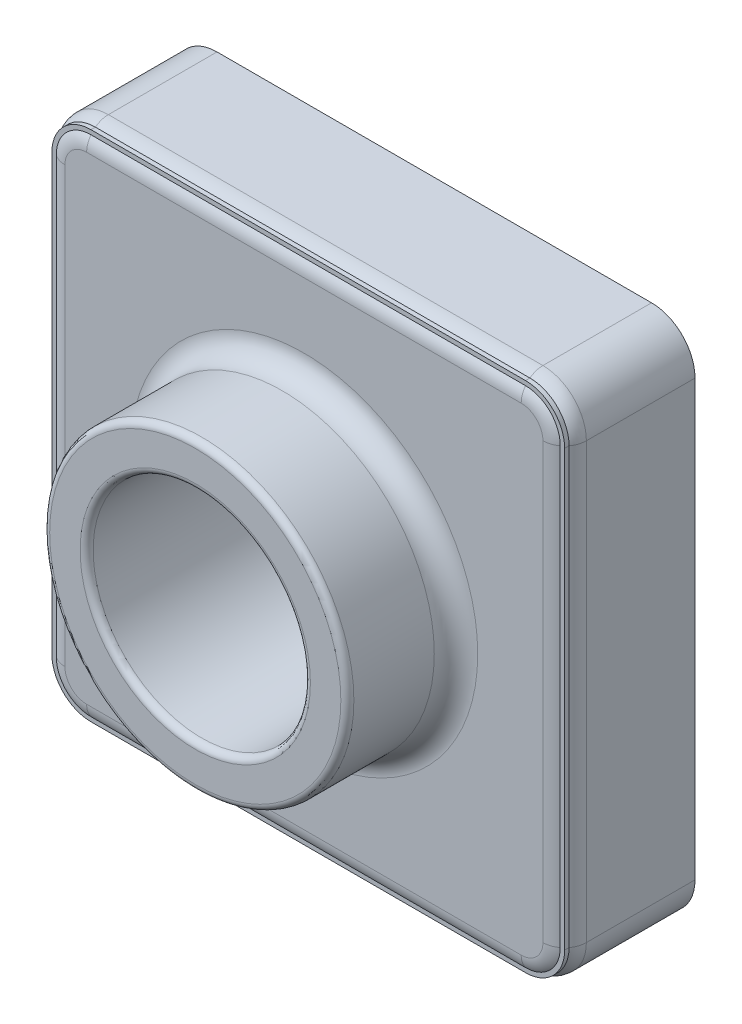
ISO-10303-21;
HEADER;
FILE_DESCRIPTION(('STEP AP214'),'2;1');
FILE_NAME('part.step','',(''),(''),'','','');
FILE_SCHEMA(('AUTOMOTIVE_DESIGN { 1 0 10303 214 1 1 1 1 }'));
ENDSEC;
DATA;
#1=APPLICATION_CONTEXT('core data for automotive mechanical design processes');
#2=APPLICATION_PROTOCOL_DEFINITION('international standard','automotive_design',2000,#1);
#3=PRODUCT_CONTEXT('',#1,'mechanical');
#4=PRODUCT('Part','Part','',(#3));
#5=PRODUCT_RELATED_PRODUCT_CATEGORY('part','',(#4));
#6=PRODUCT_DEFINITION_FORMATION('','',#4);
#7=PRODUCT_DEFINITION_CONTEXT('part definition',#1,'design');
#8=PRODUCT_DEFINITION('design','',#6,#7);
#9=PRODUCT_DEFINITION_SHAPE('','',#8);
#10=(LENGTH_UNIT() NAMED_UNIT(*) SI_UNIT(.MILLI.,.METRE.));
#11=(NAMED_UNIT(*) PLANE_ANGLE_UNIT() SI_UNIT($,.RADIAN.));
#12=(NAMED_UNIT(*) SI_UNIT($,.STERADIAN.) SOLID_ANGLE_UNIT());
#13=UNCERTAINTY_MEASURE_WITH_UNIT(LENGTH_MEASURE(1.E-05),#10,'distance_accuracy_value','');
#14=(GEOMETRIC_REPRESENTATION_CONTEXT(3) GLOBAL_UNCERTAINTY_ASSIGNED_CONTEXT((#13)) GLOBAL_UNIT_ASSIGNED_CONTEXT((#10,
#11,#12)) REPRESENTATION_CONTEXT('',''));
#15=CARTESIAN_POINT('',(0.,0.,0.));
#16=DIRECTION('',(0.,0.,1.));
#17=DIRECTION('',(1.,0.,0.));
#18=AXIS2_PLACEMENT_3D('',#15,#16,#17);
#19=CARTESIAN_POINT('',(60.,-60.,-30.));
#20=DIRECTION('',(0.,0.,1.));
#21=DIRECTION('',(1.,0.,0.));
#22=AXIS2_PLACEMENT_3D('',#19,#20,#21);
#23=PLANE('',#22);
#24=CARTESIAN_POINT('',(0.,0.,-30.));
#25=DIRECTION('',(0.,0.,1.));
#26=DIRECTION('',(1.,0.,0.));
#27=AXIS2_PLACEMENT_3D('',#24,#25,#26);
#28=CIRCLE('',#27,25.);
#29=CARTESIAN_POINT('',(25.,0.,-30.));
#30=VERTEX_POINT('',#29);
#31=EDGE_CURVE('E224',#30,#30,#28,.T.);
#32=ORIENTED_EDGE('',*,*,#31,.T.);
#33=EDGE_LOOP('',(#32));
#34=FACE_BOUND('',#33,.T.);
#35=CARTESIAN_POINT('',(0.,0.,-30.));
#36=DIRECTION('',(0.,0.,1.));
#37=DIRECTION('',(1.,0.,0.));
#38=AXIS2_PLACEMENT_3D('',#35,#36,#37);
#39=CIRCLE('',#38,26.);
#40=CARTESIAN_POINT('',(26.,0.,-30.));
#41=VERTEX_POINT('',#40);
#42=EDGE_CURVE('E243',#41,#41,#39,.T.);
#43=ORIENTED_EDGE('',*,*,#42,.F.);
#44=EDGE_LOOP('',(#43));
#45=FACE_BOUND('',#44,.T.);
#46=ADVANCED_FACE('F33',(#34,#45),#23,.F.);
#47=CARTESIAN_POINT('',(60.,-60.,0.));
#48=DIRECTION('',(0.,0.,1.));
#49=DIRECTION('',(1.,0.,0.));
#50=AXIS2_PLACEMENT_3D('',#47,#48,#49);
#51=PLANE('',#50);
#52=DIRECTION('',(-1.,0.,0.));
#53=VECTOR('',#52,1.);
#54=CARTESIAN_POINT('',(60.,55.,0.));
#55=LINE('',#54,#53);
#56=CARTESIAN_POINT('',(50.,55.,0.));
#57=VERTEX_POINT('',#56);
#58=CARTESIAN_POINT('',(-50.,55.,0.));
#59=VERTEX_POINT('',#58);
#60=EDGE_CURVE('E317',#57,#59,#55,.T.);
#61=ORIENTED_EDGE('',*,*,#60,.T.);
#62=CARTESIAN_POINT('',(-50.,50.,0.));
#63=DIRECTION('',(0.,0.,1.));
#64=DIRECTION('',(1.,0.,0.));
#65=AXIS2_PLACEMENT_3D('',#62,#63,#64);
#66=CIRCLE('',#65,5.);
#67=CARTESIAN_POINT('',(-55.,50.,0.));
#68=VERTEX_POINT('',#67);
#69=EDGE_CURVE('E319',#59,#68,#66,.T.);
#70=ORIENTED_EDGE('',*,*,#69,.T.);
#71=DIRECTION('',(0.,-1.,0.));
#72=VECTOR('',#71,1.);
#73=CARTESIAN_POINT('',(-55.,-60.,0.));
#74=LINE('',#73,#72);
#75=CARTESIAN_POINT('',(-55.,-50.,0.));
#76=VERTEX_POINT('',#75);
#77=EDGE_CURVE('E305',#68,#76,#74,.T.);
#78=ORIENTED_EDGE('',*,*,#77,.T.);
#79=CARTESIAN_POINT('',(-50.,-50.,0.));
#80=DIRECTION('',(0.,0.,1.));
#81=DIRECTION('',(1.,0.,0.));
#82=AXIS2_PLACEMENT_3D('',#79,#80,#81);
#83=CIRCLE('',#82,5.);
#84=CARTESIAN_POINT('',(-50.,-55.,0.));
#85=VERTEX_POINT('',#84);
#86=EDGE_CURVE('E307',#76,#85,#83,.T.);
#87=ORIENTED_EDGE('',*,*,#86,.T.);
#88=DIRECTION('',(1.,0.,0.));
#89=VECTOR('',#88,1.);
#90=CARTESIAN_POINT('',(60.,-55.,0.));
#91=LINE('',#90,#89);
#92=CARTESIAN_POINT('',(50.,-55.,0.));
#93=VERTEX_POINT('',#92);
#94=EDGE_CURVE('E309',#85,#93,#91,.T.);
#95=ORIENTED_EDGE('',*,*,#94,.T.);
#96=CARTESIAN_POINT('',(50.,-50.,0.));
#97=DIRECTION('',(0.,0.,1.));
#98=DIRECTION('',(1.,0.,0.));
#99=AXIS2_PLACEMENT_3D('',#96,#97,#98);
#100=CIRCLE('',#99,5.);
#101=CARTESIAN_POINT('',(55.,-50.,0.));
#102=VERTEX_POINT('',#101);
#103=EDGE_CURVE('E311',#93,#102,#100,.T.);
#104=ORIENTED_EDGE('',*,*,#103,.T.);
#105=DIRECTION('',(0.,1.,0.));
#106=VECTOR('',#105,1.);
#107=CARTESIAN_POINT('',(55.,-60.,0.));
#108=LINE('',#107,#106);
#109=CARTESIAN_POINT('',(55.,50.,0.));
#110=VERTEX_POINT('',#109);
#111=EDGE_CURVE('E313',#102,#110,#108,.T.);
#112=ORIENTED_EDGE('',*,*,#111,.T.);
#113=CARTESIAN_POINT('',(50.,50.,0.));
#114=DIRECTION('',(0.,0.,1.));
#115=DIRECTION('',(1.,0.,0.));
#116=AXIS2_PLACEMENT_3D('',#113,#114,#115);
#117=CIRCLE('',#116,5.);
#118=EDGE_CURVE('E315',#110,#57,#117,.T.);
#119=ORIENTED_EDGE('',*,*,#118,.T.);
#120=EDGE_LOOP('',(#61,#70,#78,#87,#95,#104,#112,#119));
#121=FACE_BOUND('',#120,.T.);
#122=CARTESIAN_POINT('',(0.,0.,0.));
#123=DIRECTION('',(0.,0.,1.));
#124=DIRECTION('',(1.,0.,0.));
#125=AXIS2_PLACEMENT_3D('',#122,#123,#124);
#126=CIRCLE('',#125,40.);
#127=CARTESIAN_POINT('',(40.,0.,0.));
#128=VERTEX_POINT('',#127);
#129=EDGE_CURVE('E290',#128,#128,#126,.F.);
#130=ORIENTED_EDGE('',*,*,#129,.T.);
#131=EDGE_LOOP('',(#130));
#132=FACE_BOUND('',#131,.T.);
#133=ADVANCED_FACE('F413',(#121,#132),#51,.T.);
#134=CARTESIAN_POINT('',(60.,60.,-30.));
#135=DIRECTION('',(1.,0.,0.));
#136=DIRECTION('',(0.,1.,0.));
#137=AXIS2_PLACEMENT_3D('',#134,#135,#136);
#138=PLANE('',#137);
#139=DIRECTION('',(0.,0.,1.));
#140=VECTOR('',#139,1.);
#141=CARTESIAN_POINT('',(60.,50.,-30.));
#142=LINE('',#141,#140);
#143=CARTESIAN_POINT('',(60.,50.,-30.));
#144=VERTEX_POINT('',#143);
#145=CARTESIAN_POINT('',(60.,50.,-5.));
#146=VERTEX_POINT('',#145);
#147=EDGE_CURVE('E260',#144,#146,#142,.T.);
#148=ORIENTED_EDGE('',*,*,#147,.T.);
#149=DIRECTION('',(0.,1.,0.));
#150=VECTOR('',#149,1.);
#151=CARTESIAN_POINT('',(60.,60.,-5.));
#152=LINE('',#151,#150);
#153=CARTESIAN_POINT('',(60.,-50.,-5.));
#154=VERTEX_POINT('',#153);
#155=EDGE_CURVE('E329',#146,#154,#152,.F.);
#156=ORIENTED_EDGE('',*,*,#155,.T.);
#157=DIRECTION('',(0.,0.,1.));
#158=VECTOR('',#157,1.);
#159=CARTESIAN_POINT('',(60.,-50.,-30.));
#160=LINE('',#159,#158);
#161=CARTESIAN_POINT('',(60.,-50.,-30.));
#162=VERTEX_POINT('',#161);
#163=EDGE_CURVE('E285',#154,#162,#160,.F.);
#164=ORIENTED_EDGE('',*,*,#163,.T.);
#165=DIRECTION('',(0.,1.,0.));
#166=VECTOR('',#165,1.);
#167=CARTESIAN_POINT('',(60.,60.,-30.));
#168=LINE('',#167,#166);
#169=EDGE_CURVE('E249',#162,#144,#168,.T.);
#170=ORIENTED_EDGE('',*,*,#169,.T.);
#171=EDGE_LOOP('',(#148,#156,#164,#170));
#172=FACE_BOUND('',#171,.T.);
#173=ADVANCED_FACE('F411',(#172),#138,.T.);
#174=CARTESIAN_POINT('',(-60.,-60.,-30.));
#175=DIRECTION('',(0.,-1.,0.));
#176=DIRECTION('',(0.,0.,-1.));
#177=AXIS2_PLACEMENT_3D('',#174,#175,#176);
#178=PLANE('',#177);
#179=DIRECTION('',(0.,0.,1.));
#180=VECTOR('',#179,1.);
#181=CARTESIAN_POINT('',(50.,-60.,-30.));
#182=LINE('',#181,#180);
#183=CARTESIAN_POINT('',(50.,-60.,-30.));
#184=VERTEX_POINT('',#183);
#185=CARTESIAN_POINT('',(50.,-60.,-5.));
#186=VERTEX_POINT('',#185);
#187=EDGE_CURVE('E277',#184,#186,#182,.T.);
#188=ORIENTED_EDGE('',*,*,#187,.T.);
#189=DIRECTION('',(1.,0.,0.));
#190=VECTOR('',#189,1.);
#191=CARTESIAN_POINT('',(-60.,-60.,-5.));
#192=LINE('',#191,#190);
#193=CARTESIAN_POINT('',(-50.,-60.,-5.));
#194=VERTEX_POINT('',#193);
#195=EDGE_CURVE('E57',#186,#194,#192,.F.);
#196=ORIENTED_EDGE('',*,*,#195,.T.);
#197=DIRECTION('',(0.,0.,1.));
#198=VECTOR('',#197,1.);
#199=CARTESIAN_POINT('',(-50.,-60.,-30.));
#200=LINE('',#199,#198);
#201=CARTESIAN_POINT('',(-50.,-60.,-30.));
#202=VERTEX_POINT('',#201);
#203=EDGE_CURVE('E279',#194,#202,#200,.F.);
#204=ORIENTED_EDGE('',*,*,#203,.T.);
#205=DIRECTION('',(1.,0.,0.));
#206=VECTOR('',#205,1.);
#207=CARTESIAN_POINT('',(-60.,-60.,-30.));
#208=LINE('',#207,#206);
#209=EDGE_CURVE('E257',#202,#184,#208,.T.);
#210=ORIENTED_EDGE('',*,*,#209,.T.);
#211=EDGE_LOOP('',(#188,#196,#204,#210));
#212=FACE_BOUND('',#211,.T.);
#213=ADVANCED_FACE('F370',(#212),#178,.T.);
#214=CARTESIAN_POINT('',(-60.,60.,-30.));
#215=DIRECTION('',(-1.,0.,0.));
#216=DIRECTION('',(0.,-1.,0.));
#217=AXIS2_PLACEMENT_3D('',#214,#215,#216);
#218=PLANE('',#217);
#219=DIRECTION('',(0.,0.,1.));
#220=VECTOR('',#219,1.);
#221=CARTESIAN_POINT('',(-60.,-50.,-30.));
#222=LINE('',#221,#220);
#223=CARTESIAN_POINT('',(-60.,-50.,-30.));
#224=VERTEX_POINT('',#223);
#225=CARTESIAN_POINT('',(-60.,-50.,-5.));
#226=VERTEX_POINT('',#225);
#227=EDGE_CURVE('E275',#224,#226,#222,.T.);
#228=ORIENTED_EDGE('',*,*,#227,.T.);
#229=DIRECTION('',(0.,-1.,0.));
#230=VECTOR('',#229,1.);
#231=CARTESIAN_POINT('',(-60.,60.,-5.));
#232=LINE('',#231,#230);
#233=CARTESIAN_POINT('',(-60.,50.,-5.));
#234=VERTEX_POINT('',#233);
#235=EDGE_CURVE('E11',#226,#234,#232,.F.);
#236=ORIENTED_EDGE('',*,*,#235,.T.);
#237=DIRECTION('',(0.,0.,1.));
#238=VECTOR('',#237,1.);
#239=CARTESIAN_POINT('',(-60.,50.,-30.));
#240=LINE('',#239,#238);
#241=CARTESIAN_POINT('',(-60.,50.,-30.));
#242=VERTEX_POINT('',#241);
#243=EDGE_CURVE('E271',#234,#242,#240,.F.);
#244=ORIENTED_EDGE('',*,*,#243,.T.);
#245=DIRECTION('',(0.,-1.,0.));
#246=VECTOR('',#245,1.);
#247=CARTESIAN_POINT('',(-60.,60.,-30.));
#248=LINE('',#247,#246);
#249=EDGE_CURVE('E254',#242,#224,#248,.T.);
#250=ORIENTED_EDGE('',*,*,#249,.T.);
#251=EDGE_LOOP('',(#228,#236,#244,#250));
#252=FACE_BOUND('',#251,.T.);
#253=ADVANCED_FACE('F381',(#252),#218,.T.);
#254=CARTESIAN_POINT('',(-60.,60.,-30.));
#255=DIRECTION('',(0.,1.,0.));
#256=DIRECTION('',(0.,0.,1.));
#257=AXIS2_PLACEMENT_3D('',#254,#255,#256);
#258=PLANE('',#257);
#259=DIRECTION('',(0.,0.,1.));
#260=VECTOR('',#259,1.);
#261=CARTESIAN_POINT('',(-50.,60.,-30.));
#262=LINE('',#261,#260);
#263=CARTESIAN_POINT('',(-50.,60.,-30.));
#264=VERTEX_POINT('',#263);
#265=CARTESIAN_POINT('',(-50.,60.,-5.));
#266=VERTEX_POINT('',#265);
#267=EDGE_CURVE('E268',#264,#266,#262,.T.);
#268=ORIENTED_EDGE('',*,*,#267,.T.);
#269=DIRECTION('',(-1.,0.,0.));
#270=VECTOR('',#269,1.);
#271=CARTESIAN_POINT('',(-60.,60.,-5.));
#272=LINE('',#271,#270);
#273=CARTESIAN_POINT('',(50.,60.,-5.));
#274=VERTEX_POINT('',#273);
#275=EDGE_CURVE('E325',#266,#274,#272,.F.);
#276=ORIENTED_EDGE('',*,*,#275,.T.);
#277=DIRECTION('',(0.,0.,1.));
#278=VECTOR('',#277,1.);
#279=CARTESIAN_POINT('',(50.,60.,-30.));
#280=LINE('',#279,#278);
#281=CARTESIAN_POINT('',(50.,60.,-30.));
#282=VERTEX_POINT('',#281);
#283=EDGE_CURVE('E263',#274,#282,#280,.F.);
#284=ORIENTED_EDGE('',*,*,#283,.T.);
#285=DIRECTION('',(-1.,0.,0.));
#286=VECTOR('',#285,1.);
#287=CARTESIAN_POINT('',(-60.,60.,-30.));
#288=LINE('',#287,#286);
#289=EDGE_CURVE('E251',#282,#264,#288,.T.);
#290=ORIENTED_EDGE('',*,*,#289,.T.);
#291=EDGE_LOOP('',(#268,#276,#284,#290));
#292=FACE_BOUND('',#291,.T.);
#293=ADVANCED_FACE('F402',(#292),#258,.T.);
#294=CARTESIAN_POINT('',(-50.,-50.,-30.));
#295=DIRECTION('',(0.,0.,1.));
#296=DIRECTION('',(1.,0.,0.));
#297=AXIS2_PLACEMENT_3D('',#294,#295,#296);
#298=CIRCLE('',#297,9.);
#299=CARTESIAN_POINT('',(-50.,-59.,-30.));
#300=VERTEX_POINT('',#299);
#301=CARTESIAN_POINT('',(-59.,-50.,-30.));
#302=VERTEX_POINT('',#301);
#303=EDGE_CURVE('E201',#300,#302,#298,.F.);
#304=ORIENTED_EDGE('',*,*,#303,.F.);
#305=DIRECTION('',(1.,0.,0.));
#306=VECTOR('',#305,1.);
#307=CARTESIAN_POINT('',(60.,-59.,-30.));
#308=LINE('',#307,#306);
#309=CARTESIAN_POINT('',(50.,-59.,-30.));
#310=VERTEX_POINT('',#309);
#311=EDGE_CURVE('E197',#300,#310,#308,.T.);
#312=ORIENTED_EDGE('',*,*,#311,.T.);
#313=CARTESIAN_POINT('',(50.,-50.,-30.));
#314=DIRECTION('',(0.,0.,1.));
#315=DIRECTION('',(1.,0.,0.));
#316=AXIS2_PLACEMENT_3D('',#313,#314,#315);
#317=CIRCLE('',#316,9.);
#318=CARTESIAN_POINT('',(59.,-50.,-30.));
#319=VERTEX_POINT('',#318);
#320=EDGE_CURVE('E199',#319,#310,#317,.F.);
#321=ORIENTED_EDGE('',*,*,#320,.F.);
#322=DIRECTION('',(0.,1.,0.));
#323=VECTOR('',#322,1.);
#324=CARTESIAN_POINT('',(59.,-60.,-30.));
#325=LINE('',#324,#323);
#326=CARTESIAN_POINT('',(59.,50.,-30.));
#327=VERTEX_POINT('',#326);
#328=EDGE_CURVE('E192',#319,#327,#325,.T.);
#329=ORIENTED_EDGE('',*,*,#328,.T.);
#330=CARTESIAN_POINT('',(50.,50.,-30.));
#331=DIRECTION('',(0.,0.,1.));
#332=DIRECTION('',(1.,0.,0.));
#333=AXIS2_PLACEMENT_3D('',#330,#331,#332);
#334=CIRCLE('',#333,9.);
#335=CARTESIAN_POINT('',(50.,59.,-30.));
#336=VERTEX_POINT('',#335);
#337=EDGE_CURVE('E239',#336,#327,#334,.F.);
#338=ORIENTED_EDGE('',*,*,#337,.F.);
#339=DIRECTION('',(-1.,0.,0.));
#340=VECTOR('',#339,1.);
#341=CARTESIAN_POINT('',(60.,59.,-30.));
#342=LINE('',#341,#340);
#343=CARTESIAN_POINT('',(-50.,59.,-30.));
#344=VERTEX_POINT('',#343);
#345=EDGE_CURVE('E226',#336,#344,#342,.T.);
#346=ORIENTED_EDGE('',*,*,#345,.T.);
#347=CARTESIAN_POINT('',(-50.,50.,-30.));
#348=DIRECTION('',(0.,0.,1.));
#349=DIRECTION('',(1.,0.,0.));
#350=AXIS2_PLACEMENT_3D('',#347,#348,#349);
#351=CIRCLE('',#350,9.);
#352=CARTESIAN_POINT('',(-59.,50.,-30.));
#353=VERTEX_POINT('',#352);
#354=EDGE_CURVE('E234',#353,#344,#351,.F.);
#355=ORIENTED_EDGE('',*,*,#354,.F.);
#356=DIRECTION('',(0.,-1.,0.));
#357=VECTOR('',#356,1.);
#358=CARTESIAN_POINT('',(-59.,-60.,-30.));
#359=LINE('',#358,#357);
#360=EDGE_CURVE('E230',#353,#302,#359,.T.);
#361=ORIENTED_EDGE('',*,*,#360,.T.);
#362=EDGE_LOOP('',(#304,#312,#321,#329,#338,#346,#355,#361));
#363=FACE_BOUND('',#362,.T.);
#364=ORIENTED_EDGE('',*,*,#209,.F.);
#365=CARTESIAN_POINT('',(-50.,-50.,-30.));
#366=DIRECTION('',(0.,0.,1.));
#367=DIRECTION('',(1.,0.,0.));
#368=AXIS2_PLACEMENT_3D('',#365,#366,#367);
#369=CIRCLE('',#368,10.);
#370=EDGE_CURVE('E283',#202,#224,#369,.F.);
#371=ORIENTED_EDGE('',*,*,#370,.T.);
#372=ORIENTED_EDGE('',*,*,#249,.F.);
#373=CARTESIAN_POINT('',(-50.,50.,-30.));
#374=DIRECTION('',(0.,0.,1.));
#375=DIRECTION('',(1.,0.,0.));
#376=AXIS2_PLACEMENT_3D('',#373,#374,#375);
#377=CIRCLE('',#376,10.);
#378=EDGE_CURVE('E273',#242,#264,#377,.F.);
#379=ORIENTED_EDGE('',*,*,#378,.T.);
#380=ORIENTED_EDGE('',*,*,#289,.F.);
#381=CARTESIAN_POINT('',(50.,50.,-30.));
#382=DIRECTION('',(0.,0.,1.));
#383=DIRECTION('',(1.,0.,0.));
#384=AXIS2_PLACEMENT_3D('',#381,#382,#383);
#385=CIRCLE('',#384,10.);
#386=EDGE_CURVE('E265',#282,#144,#385,.F.);
#387=ORIENTED_EDGE('',*,*,#386,.T.);
#388=ORIENTED_EDGE('',*,*,#169,.F.);
#389=CARTESIAN_POINT('',(50.,-50.,-30.));
#390=DIRECTION('',(0.,0.,1.));
#391=DIRECTION('',(1.,0.,0.));
#392=AXIS2_PLACEMENT_3D('',#389,#390,#391);
#393=CIRCLE('',#392,10.);
#394=EDGE_CURVE('E281',#162,#184,#393,.F.);
#395=ORIENTED_EDGE('',*,*,#394,.T.);
#396=EDGE_LOOP('',(#364,#371,#372,#379,#380,#387,#388,#395));
#397=FACE_BOUND('',#396,.T.);
#398=ADVANCED_FACE('F374',(#363,#397),#23,.F.);
#399=CARTESIAN_POINT('',(0.,0.,25.));
#400=DIRECTION('',(0.,0.,-1.));
#401=DIRECTION('',(-1.,0.,0.));
#402=AXIS2_PLACEMENT_3D('',#399,#400,#401);
#403=CYLINDRICAL_SURFACE('',#402,35.);
#404=CARTESIAN_POINT('',(0.,0.,23.5));
#405=DIRECTION('',(0.,0.,1.));
#406=DIRECTION('',(1.,0.,0.));
#407=AXIS2_PLACEMENT_3D('',#404,#405,#406);
#408=CIRCLE('',#407,35.);
#409=CARTESIAN_POINT('',(35.,0.,23.5));
#410=VERTEX_POINT('',#409);
#411=EDGE_CURVE('E299',#410,#410,#408,.F.);
#412=ORIENTED_EDGE('',*,*,#411,.T.);
#413=EDGE_LOOP('',(#412));
#414=FACE_BOUND('',#413,.T.);
#415=CARTESIAN_POINT('',(0.,0.,5.));
#416=DIRECTION('',(0.,0.,1.));
#417=DIRECTION('',(1.,0.,0.));
#418=AXIS2_PLACEMENT_3D('',#415,#416,#417);
#419=CIRCLE('',#418,35.);
#420=CARTESIAN_POINT('',(35.,0.,5.));
#421=VERTEX_POINT('',#420);
#422=EDGE_CURVE('E287',#421,#421,#419,.T.);
#423=ORIENTED_EDGE('',*,*,#422,.T.);
#424=EDGE_LOOP('',(#423));
#425=FACE_BOUND('',#424,.T.);
#426=ADVANCED_FACE('F432',(#414,#425),#403,.T.);
#427=CARTESIAN_POINT('',(0.,0.,25.));
#428=DIRECTION('',(0.,0.,1.));
#429=DIRECTION('',(1.,0.,0.));
#430=AXIS2_PLACEMENT_3D('',#427,#428,#429);
#431=PLANE('',#430);
#432=CARTESIAN_POINT('',(0.,0.,25.));
#433=DIRECTION('',(0.,0.,1.));
#434=DIRECTION('',(1.,0.,0.));
#435=AXIS2_PLACEMENT_3D('',#432,#433,#434);
#436=CIRCLE('',#435,33.5);
#437=CARTESIAN_POINT('',(33.5,0.,25.));
#438=VERTEX_POINT('',#437);
#439=EDGE_CURVE('E296',#438,#438,#436,.T.);
#440=ORIENTED_EDGE('',*,*,#439,.T.);
#441=EDGE_LOOP('',(#440));
#442=FACE_BOUND('',#441,.T.);
#443=CARTESIAN_POINT('',(0.,0.,25.));
#444=DIRECTION('',(0.,0.,1.));
#445=DIRECTION('',(1.,0.,0.));
#446=AXIS2_PLACEMENT_3D('',#443,#444,#445);
#447=CIRCLE('',#446,26.5);
#448=CARTESIAN_POINT('',(26.5,0.,25.));
#449=VERTEX_POINT('',#448);
#450=EDGE_CURVE('E293',#449,#449,#447,.F.);
#451=ORIENTED_EDGE('',*,*,#450,.T.);
#452=EDGE_LOOP('',(#451));
#453=FACE_BOUND('',#452,.T.);
#454=ADVANCED_FACE('F438',(#442,#453),#431,.T.);
#455=CARTESIAN_POINT('',(50.,50.,-30.));
#456=DIRECTION('',(0.,0.,1.));
#457=DIRECTION('',(1.,0.,0.));
#458=AXIS2_PLACEMENT_3D('',#455,#456,#457);
#459=CYLINDRICAL_SURFACE('',#458,10.);
#460=ORIENTED_EDGE('',*,*,#283,.F.);
#461=CARTESIAN_POINT('',(50.,50.,-5.));
#462=DIRECTION('',(0.,0.,1.));
#463=DIRECTION('',(1.,0.,0.));
#464=AXIS2_PLACEMENT_3D('',#461,#462,#463);
#465=CIRCLE('',#464,10.);
#466=EDGE_CURVE('E327',#274,#146,#465,.F.);
#467=ORIENTED_EDGE('',*,*,#466,.T.);
#468=ORIENTED_EDGE('',*,*,#147,.F.);
#469=ORIENTED_EDGE('',*,*,#386,.F.);
#470=EDGE_LOOP('',(#460,#467,#468,#469));
#471=FACE_BOUND('',#470,.T.);
#472=ADVANCED_FACE('F408',(#471),#459,.T.);
#473=CARTESIAN_POINT('',(-50.,50.,-30.));
#474=DIRECTION('',(0.,0.,1.));
#475=DIRECTION('',(1.,0.,0.));
#476=AXIS2_PLACEMENT_3D('',#473,#474,#475);
#477=CYLINDRICAL_SURFACE('',#476,10.);
#478=ORIENTED_EDGE('',*,*,#243,.F.);
#479=CARTESIAN_POINT('',(-50.,50.,-5.));
#480=DIRECTION('',(0.,0.,1.));
#481=DIRECTION('',(1.,0.,0.));
#482=AXIS2_PLACEMENT_3D('',#479,#480,#481);
#483=CIRCLE('',#482,10.);
#484=EDGE_CURVE('E322',#234,#266,#483,.F.);
#485=ORIENTED_EDGE('',*,*,#484,.T.);
#486=ORIENTED_EDGE('',*,*,#267,.F.);
#487=ORIENTED_EDGE('',*,*,#378,.F.);
#488=EDGE_LOOP('',(#478,#485,#486,#487));
#489=FACE_BOUND('',#488,.T.);
#490=ADVANCED_FACE('F399',(#489),#477,.T.);
#491=CARTESIAN_POINT('',(-50.,-50.,-30.));
#492=DIRECTION('',(0.,0.,1.));
#493=DIRECTION('',(1.,0.,0.));
#494=AXIS2_PLACEMENT_3D('',#491,#492,#493);
#495=CYLINDRICAL_SURFACE('',#494,10.);
#496=ORIENTED_EDGE('',*,*,#203,.F.);
#497=CARTESIAN_POINT('',(-50.,-50.,-5.));
#498=DIRECTION('',(0.,0.,1.));
#499=DIRECTION('',(1.,0.,0.));
#500=AXIS2_PLACEMENT_3D('',#497,#498,#499);
#501=CIRCLE('',#500,10.);
#502=EDGE_CURVE('E42',#194,#226,#501,.F.);
#503=ORIENTED_EDGE('',*,*,#502,.T.);
#504=ORIENTED_EDGE('',*,*,#227,.F.);
#505=ORIENTED_EDGE('',*,*,#370,.F.);
#506=EDGE_LOOP('',(#496,#503,#504,#505));
#507=FACE_BOUND('',#506,.T.);
#508=ADVANCED_FACE('F377',(#507),#495,.T.);
#509=CARTESIAN_POINT('',(50.,-50.,-30.));
#510=DIRECTION('',(0.,0.,1.));
#511=DIRECTION('',(1.,0.,0.));
#512=AXIS2_PLACEMENT_3D('',#509,#510,#511);
#513=CYLINDRICAL_SURFACE('',#512,10.);
#514=ORIENTED_EDGE('',*,*,#163,.F.);
#515=CARTESIAN_POINT('',(50.,-50.,-5.));
#516=DIRECTION('',(0.,0.,1.));
#517=DIRECTION('',(1.,0.,0.));
#518=AXIS2_PLACEMENT_3D('',#515,#516,#517);
#519=CIRCLE('',#518,10.);
#520=EDGE_CURVE('E331',#154,#186,#519,.F.);
#521=ORIENTED_EDGE('',*,*,#520,.T.);
#522=ORIENTED_EDGE('',*,*,#187,.F.);
#523=ORIENTED_EDGE('',*,*,#394,.F.);
#524=EDGE_LOOP('',(#514,#521,#522,#523));
#525=FACE_BOUND('',#524,.T.);
#526=ADVANCED_FACE('F368',(#525),#513,.T.);
#527=CARTESIAN_POINT('',(0.,0.,5.));
#528=DIRECTION('',(0.,0.,1.));
#529=DIRECTION('',(1.,0.,0.));
#530=AXIS2_PLACEMENT_3D('',#527,#528,#529);
#531=TOROIDAL_SURFACE('',#530,40.,5.);
#532=ORIENTED_EDGE('',*,*,#129,.F.);
#533=EDGE_LOOP('',(#532));
#534=FACE_BOUND('',#533,.T.);
#535=ORIENTED_EDGE('',*,*,#422,.F.);
#536=EDGE_LOOP('',(#535));
#537=FACE_BOUND('',#536,.T.);
#538=ADVANCED_FACE('F533',(#534,#537),#531,.F.);
#539=CARTESIAN_POINT('',(0.,0.,-30.));
#540=DIRECTION('',(0.,0.,1.));
#541=DIRECTION('',(1.,0.,0.));
#542=AXIS2_PLACEMENT_3D('',#539,#540,#541);
#543=CYLINDRICAL_SURFACE('',#542,25.);
#544=CARTESIAN_POINT('',(0.,0.,23.5));
#545=DIRECTION('',(0.,0.,1.));
#546=DIRECTION('',(1.,0.,0.));
#547=AXIS2_PLACEMENT_3D('',#544,#545,#546);
#548=CIRCLE('',#547,25.);
#549=CARTESIAN_POINT('',(25.,0.,23.5));
#550=VERTEX_POINT('',#549);
#551=EDGE_CURVE('E302',#550,#550,#548,.T.);
#552=ORIENTED_EDGE('',*,*,#551,.T.);
#553=EDGE_LOOP('',(#552));
#554=FACE_BOUND('',#553,.T.);
#555=ORIENTED_EDGE('',*,*,#31,.F.);
#556=EDGE_LOOP('',(#555));
#557=FACE_BOUND('',#556,.T.);
#558=ADVANCED_FACE('F530',(#554,#557),#543,.F.);
#559=CARTESIAN_POINT('',(0.,0.,23.5));
#560=DIRECTION('',(0.,0.,1.));
#561=DIRECTION('',(1.,0.,0.));
#562=AXIS2_PLACEMENT_3D('',#559,#560,#561);
#563=TOROIDAL_SURFACE('',#562,33.5,1.5);
#564=ORIENTED_EDGE('',*,*,#411,.F.);
#565=EDGE_LOOP('',(#564));
#566=FACE_BOUND('',#565,.T.);
#567=ORIENTED_EDGE('',*,*,#439,.F.);
#568=EDGE_LOOP('',(#567));
#569=FACE_BOUND('',#568,.T.);
#570=ADVANCED_FACE('F485',(#566,#569),#563,.T.);
#571=CARTESIAN_POINT('',(0.,0.,23.5));
#572=DIRECTION('',(0.,0.,1.));
#573=DIRECTION('',(1.,0.,0.));
#574=AXIS2_PLACEMENT_3D('',#571,#572,#573);
#575=TOROIDAL_SURFACE('',#574,26.5,1.5);
#576=ORIENTED_EDGE('',*,*,#450,.F.);
#577=EDGE_LOOP('',(#576));
#578=FACE_BOUND('',#577,.T.);
#579=ORIENTED_EDGE('',*,*,#551,.F.);
#580=EDGE_LOOP('',(#579));
#581=FACE_BOUND('',#580,.T.);
#582=ADVANCED_FACE('F477',(#578,#581),#575,.T.);
#583=CARTESIAN_POINT('',(60.,-60.,-1.));
#584=DIRECTION('',(0.,0.,1.));
#585=DIRECTION('',(1.,0.,0.));
#586=AXIS2_PLACEMENT_3D('',#583,#584,#585);
#587=PLANE('',#586);
#588=CARTESIAN_POINT('',(0.,0.,-0.999999999999999));
#589=DIRECTION('',(0.,0.,1.));
#590=DIRECTION('',(1.,0.,0.));
#591=AXIS2_PLACEMENT_3D('',#588,#589,#590);
#592=CIRCLE('',#591,40.);
#593=CARTESIAN_POINT('',(40.,0.,-0.999999999999999));
#594=VERTEX_POINT('',#593);
#595=EDGE_CURVE('E210',#594,#594,#592,.F.);
#596=ORIENTED_EDGE('',*,*,#595,.F.);
#597=EDGE_LOOP('',(#596));
#598=FACE_BOUND('',#597,.T.);
#599=DIRECTION('',(0.,-1.,0.));
#600=VECTOR('',#599,1.);
#601=CARTESIAN_POINT('',(-59.,-60.,-1.));
#602=LINE('',#601,#600);
#603=CARTESIAN_POINT('',(-59.,50.,-1.));
#604=VERTEX_POINT('',#603);
#605=CARTESIAN_POINT('',(-59.,-50.,-1.));
#606=VERTEX_POINT('',#605);
#607=EDGE_CURVE('E193',#604,#606,#602,.T.);
#608=ORIENTED_EDGE('',*,*,#607,.F.);
#609=CARTESIAN_POINT('',(-50.,50.,-1.));
#610=DIRECTION('',(0.,0.,1.));
#611=DIRECTION('',(1.,0.,0.));
#612=AXIS2_PLACEMENT_3D('',#609,#610,#611);
#613=CIRCLE('',#612,9.);
#614=CARTESIAN_POINT('',(-50.,59.,-1.));
#615=VERTEX_POINT('',#614);
#616=EDGE_CURVE('E456',#615,#604,#613,.T.);
#617=ORIENTED_EDGE('',*,*,#616,.F.);
#618=DIRECTION('',(-1.,0.,0.));
#619=VECTOR('',#618,1.);
#620=CARTESIAN_POINT('',(60.,59.,-1.));
#621=LINE('',#620,#619);
#622=CARTESIAN_POINT('',(50.,59.,-1.));
#623=VERTEX_POINT('',#622);
#624=EDGE_CURVE('E451',#623,#615,#621,.T.);
#625=ORIENTED_EDGE('',*,*,#624,.F.);
#626=CARTESIAN_POINT('',(50.,50.,-1.));
#627=DIRECTION('',(0.,0.,1.));
#628=DIRECTION('',(1.,0.,0.));
#629=AXIS2_PLACEMENT_3D('',#626,#627,#628);
#630=CIRCLE('',#629,9.);
#631=CARTESIAN_POINT('',(59.,50.,-1.));
#632=VERTEX_POINT('',#631);
#633=EDGE_CURVE('E452',#632,#623,#630,.T.);
#634=ORIENTED_EDGE('',*,*,#633,.F.);
#635=DIRECTION('',(0.,1.,0.));
#636=VECTOR('',#635,1.);
#637=CARTESIAN_POINT('',(59.,-60.,-1.));
#638=LINE('',#637,#636);
#639=CARTESIAN_POINT('',(59.,-50.,-1.));
#640=VERTEX_POINT('',#639);
#641=EDGE_CURVE('E246',#640,#632,#638,.T.);
#642=ORIENTED_EDGE('',*,*,#641,.F.);
#643=CARTESIAN_POINT('',(50.,-50.,-1.));
#644=DIRECTION('',(0.,0.,1.));
#645=DIRECTION('',(1.,0.,0.));
#646=AXIS2_PLACEMENT_3D('',#643,#644,#645);
#647=CIRCLE('',#646,9.);
#648=CARTESIAN_POINT('',(50.,-59.,-1.));
#649=VERTEX_POINT('',#648);
#650=EDGE_CURVE('E183',#649,#640,#647,.T.);
#651=ORIENTED_EDGE('',*,*,#650,.F.);
#652=DIRECTION('',(1.,0.,0.));
#653=VECTOR('',#652,1.);
#654=CARTESIAN_POINT('',(60.,-59.,-1.));
#655=LINE('',#654,#653);
#656=CARTESIAN_POINT('',(-50.,-59.,-1.));
#657=VERTEX_POINT('',#656);
#658=EDGE_CURVE('E186',#657,#649,#655,.T.);
#659=ORIENTED_EDGE('',*,*,#658,.F.);
#660=CARTESIAN_POINT('',(-50.,-50.,-1.));
#661=DIRECTION('',(0.,0.,1.));
#662=DIRECTION('',(1.,0.,0.));
#663=AXIS2_PLACEMENT_3D('',#660,#661,#662);
#664=CIRCLE('',#663,9.);
#665=EDGE_CURVE('E171',#606,#657,#664,.T.);
#666=ORIENTED_EDGE('',*,*,#665,.F.);
#667=EDGE_LOOP('',(#608,#617,#625,#634,#642,#651,#659,#666));
#668=FACE_BOUND('',#667,.T.);
#669=ADVANCED_FACE('F187',(#598,#668),#587,.F.);
#670=CARTESIAN_POINT('',(59.,60.,-30.));
#671=DIRECTION('',(1.,0.,0.));
#672=DIRECTION('',(0.,1.,0.));
#673=AXIS2_PLACEMENT_3D('',#670,#671,#672);
#674=PLANE('',#673);
#675=ORIENTED_EDGE('',*,*,#641,.T.);
#676=DIRECTION('',(0.,0.,1.));
#677=VECTOR('',#676,1.);
#678=CARTESIAN_POINT('',(59.,50.,-30.));
#679=LINE('',#678,#677);
#680=EDGE_CURVE('E229',#327,#632,#679,.T.);
#681=ORIENTED_EDGE('',*,*,#680,.F.);
#682=ORIENTED_EDGE('',*,*,#328,.F.);
#683=DIRECTION('',(0.,0.,1.));
#684=VECTOR('',#683,1.);
#685=CARTESIAN_POINT('',(59.,-50.,-30.));
#686=LINE('',#685,#684);
#687=EDGE_CURVE('E211',#640,#319,#686,.F.);
#688=ORIENTED_EDGE('',*,*,#687,.F.);
#689=EDGE_LOOP('',(#675,#681,#682,#688));
#690=FACE_BOUND('',#689,.T.);
#691=ADVANCED_FACE('F476',(#690),#674,.F.);
#692=CARTESIAN_POINT('',(-60.,-59.,-30.));
#693=DIRECTION('',(0.,-1.,0.));
#694=DIRECTION('',(0.,0.,-1.));
#695=AXIS2_PLACEMENT_3D('',#692,#693,#694);
#696=PLANE('',#695);
#697=ORIENTED_EDGE('',*,*,#658,.T.);
#698=DIRECTION('',(0.,0.,-1.));
#699=VECTOR('',#698,1.);
#700=CARTESIAN_POINT('',(50.,-59.,-30.));
#701=LINE('',#700,#699);
#702=EDGE_CURVE('E182',#310,#649,#701,.F.);
#703=ORIENTED_EDGE('',*,*,#702,.F.);
#704=ORIENTED_EDGE('',*,*,#311,.F.);
#705=DIRECTION('',(0.,0.,-1.));
#706=VECTOR('',#705,1.);
#707=CARTESIAN_POINT('',(-50.,-59.,-30.));
#708=LINE('',#707,#706);
#709=EDGE_CURVE('E175',#657,#300,#708,.T.);
#710=ORIENTED_EDGE('',*,*,#709,.F.);
#711=EDGE_LOOP('',(#697,#703,#704,#710));
#712=FACE_BOUND('',#711,.T.);
#713=ADVANCED_FACE('F195',(#712),#696,.F.);
#714=CARTESIAN_POINT('',(-59.,60.,-30.));
#715=DIRECTION('',(-1.,0.,0.));
#716=DIRECTION('',(0.,-1.,0.));
#717=AXIS2_PLACEMENT_3D('',#714,#715,#716);
#718=PLANE('',#717);
#719=ORIENTED_EDGE('',*,*,#360,.F.);
#720=DIRECTION('',(0.,0.,1.));
#721=VECTOR('',#720,1.);
#722=CARTESIAN_POINT('',(-59.,50.,-30.));
#723=LINE('',#722,#721);
#724=EDGE_CURVE('E236',#604,#353,#723,.F.);
#725=ORIENTED_EDGE('',*,*,#724,.F.);
#726=ORIENTED_EDGE('',*,*,#607,.T.);
#727=DIRECTION('',(0.,0.,1.));
#728=VECTOR('',#727,1.);
#729=CARTESIAN_POINT('',(-59.,-50.,-30.));
#730=LINE('',#729,#728);
#731=EDGE_CURVE('E178',#302,#606,#730,.T.);
#732=ORIENTED_EDGE('',*,*,#731,.F.);
#733=EDGE_LOOP('',(#719,#725,#726,#732));
#734=FACE_BOUND('',#733,.T.);
#735=ADVANCED_FACE('F444',(#734),#718,.F.);
#736=CARTESIAN_POINT('',(-60.,59.,-30.));
#737=DIRECTION('',(0.,1.,0.));
#738=DIRECTION('',(0.,0.,1.));
#739=AXIS2_PLACEMENT_3D('',#736,#737,#738);
#740=PLANE('',#739);
#741=ORIENTED_EDGE('',*,*,#345,.F.);
#742=DIRECTION('',(0.,0.,1.));
#743=VECTOR('',#742,1.);
#744=CARTESIAN_POINT('',(50.,59.,-30.));
#745=LINE('',#744,#743);
#746=EDGE_CURVE('E242',#623,#336,#745,.F.);
#747=ORIENTED_EDGE('',*,*,#746,.F.);
#748=ORIENTED_EDGE('',*,*,#624,.T.);
#749=DIRECTION('',(0.,0.,1.));
#750=VECTOR('',#749,1.);
#751=CARTESIAN_POINT('',(-50.,59.,-30.));
#752=LINE('',#751,#750);
#753=EDGE_CURVE('E241',#344,#615,#752,.T.);
#754=ORIENTED_EDGE('',*,*,#753,.F.);
#755=EDGE_LOOP('',(#741,#747,#748,#754));
#756=FACE_BOUND('',#755,.T.);
#757=ADVANCED_FACE('F493',(#756),#740,.F.);
#758=CARTESIAN_POINT('',(0.,0.,25.));
#759=DIRECTION('',(0.,0.,-1.));
#760=DIRECTION('',(-1.,0.,0.));
#761=AXIS2_PLACEMENT_3D('',#758,#759,#760);
#762=CYLINDRICAL_SURFACE('',#761,34.);
#763=CARTESIAN_POINT('',(0.,0.,23.5));
#764=DIRECTION('',(0.,0.,-1.));
#765=DIRECTION('',(-1.,0.,0.));
#766=AXIS2_PLACEMENT_3D('',#763,#764,#765);
#767=CIRCLE('',#766,34.);
#768=CARTESIAN_POINT('',(-34.,0.,23.5));
#769=VERTEX_POINT('',#768);
#770=EDGE_CURVE('E212',#769,#769,#767,.T.);
#771=ORIENTED_EDGE('',*,*,#770,.F.);
#772=EDGE_LOOP('',(#771));
#773=FACE_BOUND('',#772,.T.);
#774=CARTESIAN_POINT('',(0.,0.,5.));
#775=DIRECTION('',(0.,0.,-1.));
#776=DIRECTION('',(-1.,0.,0.));
#777=AXIS2_PLACEMENT_3D('',#774,#775,#776);
#778=CIRCLE('',#777,34.);
#779=CARTESIAN_POINT('',(-34.,0.,5.));
#780=VERTEX_POINT('',#779);
#781=EDGE_CURVE('E207',#780,#780,#778,.F.);
#782=ORIENTED_EDGE('',*,*,#781,.F.);
#783=EDGE_LOOP('',(#782));
#784=FACE_BOUND('',#783,.T.);
#785=ADVANCED_FACE('F496',(#773,#784),#762,.F.);
#786=CARTESIAN_POINT('',(0.,0.,24.));
#787=DIRECTION('',(0.,0.,1.));
#788=DIRECTION('',(1.,0.,0.));
#789=AXIS2_PLACEMENT_3D('',#786,#787,#788);
#790=PLANE('',#789);
#791=CARTESIAN_POINT('',(0.,0.,24.));
#792=DIRECTION('',(0.,0.,1.));
#793=DIRECTION('',(1.,0.,0.));
#794=AXIS2_PLACEMENT_3D('',#791,#792,#793);
#795=CIRCLE('',#794,33.5);
#796=CARTESIAN_POINT('',(33.5,0.,24.));
#797=VERTEX_POINT('',#796);
#798=EDGE_CURVE('E216',#797,#797,#795,.T.);
#799=ORIENTED_EDGE('',*,*,#798,.F.);
#800=EDGE_LOOP('',(#799));
#801=FACE_BOUND('',#800,.T.);
#802=CARTESIAN_POINT('',(0.,0.,24.));
#803=DIRECTION('',(0.,0.,1.));
#804=DIRECTION('',(1.,0.,0.));
#805=AXIS2_PLACEMENT_3D('',#802,#803,#804);
#806=CIRCLE('',#805,26.5);
#807=CARTESIAN_POINT('',(26.5,0.,24.));
#808=VERTEX_POINT('',#807);
#809=EDGE_CURVE('E219',#808,#808,#806,.F.);
#810=ORIENTED_EDGE('',*,*,#809,.F.);
#811=EDGE_LOOP('',(#810));
#812=FACE_BOUND('',#811,.T.);
#813=ADVANCED_FACE('F500',(#801,#812),#790,.F.);
#814=CARTESIAN_POINT('',(50.,50.,-30.));
#815=DIRECTION('',(0.,0.,1.));
#816=DIRECTION('',(1.,0.,0.));
#817=AXIS2_PLACEMENT_3D('',#814,#815,#816);
#818=CYLINDRICAL_SURFACE('',#817,9.);
#819=ORIENTED_EDGE('',*,*,#337,.T.);
#820=ORIENTED_EDGE('',*,*,#680,.T.);
#821=ORIENTED_EDGE('',*,*,#633,.T.);
#822=ORIENTED_EDGE('',*,*,#746,.T.);
#823=EDGE_LOOP('',(#819,#820,#821,#822));
#824=FACE_BOUND('',#823,.T.);
#825=ADVANCED_FACE('F504',(#824),#818,.F.);
#826=CARTESIAN_POINT('',(-50.,50.,-30.));
#827=DIRECTION('',(0.,0.,1.));
#828=DIRECTION('',(1.,0.,0.));
#829=AXIS2_PLACEMENT_3D('',#826,#827,#828);
#830=CYLINDRICAL_SURFACE('',#829,9.);
#831=ORIENTED_EDGE('',*,*,#354,.T.);
#832=ORIENTED_EDGE('',*,*,#753,.T.);
#833=ORIENTED_EDGE('',*,*,#616,.T.);
#834=ORIENTED_EDGE('',*,*,#724,.T.);
#835=EDGE_LOOP('',(#831,#832,#833,#834));
#836=FACE_BOUND('',#835,.T.);
#837=ADVANCED_FACE('F464',(#836),#830,.F.);
#838=CARTESIAN_POINT('',(-50.,-50.,-30.));
#839=DIRECTION('',(0.,0.,1.));
#840=DIRECTION('',(1.,0.,0.));
#841=AXIS2_PLACEMENT_3D('',#838,#839,#840);
#842=CYLINDRICAL_SURFACE('',#841,9.);
#843=ORIENTED_EDGE('',*,*,#303,.T.);
#844=ORIENTED_EDGE('',*,*,#731,.T.);
#845=ORIENTED_EDGE('',*,*,#665,.T.);
#846=ORIENTED_EDGE('',*,*,#709,.T.);
#847=EDGE_LOOP('',(#843,#844,#845,#846));
#848=FACE_BOUND('',#847,.T.);
#849=ADVANCED_FACE('F173',(#848),#842,.F.);
#850=CARTESIAN_POINT('',(50.,-50.,-30.));
#851=DIRECTION('',(0.,0.,1.));
#852=DIRECTION('',(1.,0.,0.));
#853=AXIS2_PLACEMENT_3D('',#850,#851,#852);
#854=CYLINDRICAL_SURFACE('',#853,9.);
#855=ORIENTED_EDGE('',*,*,#320,.T.);
#856=ORIENTED_EDGE('',*,*,#702,.T.);
#857=ORIENTED_EDGE('',*,*,#650,.T.);
#858=ORIENTED_EDGE('',*,*,#687,.T.);
#859=EDGE_LOOP('',(#855,#856,#857,#858));
#860=FACE_BOUND('',#859,.T.);
#861=ADVANCED_FACE('F513',(#860),#854,.F.);
#862=CARTESIAN_POINT('',(0.,0.,5.));
#863=DIRECTION('',(0.,0.,1.));
#864=DIRECTION('',(1.,0.,0.));
#865=AXIS2_PLACEMENT_3D('',#862,#863,#864);
#866=TOROIDAL_SURFACE('',#865,40.,6.);
#867=ORIENTED_EDGE('',*,*,#595,.T.);
#868=EDGE_LOOP('',(#867));
#869=FACE_BOUND('',#868,.T.);
#870=ORIENTED_EDGE('',*,*,#781,.T.);
#871=EDGE_LOOP('',(#870));
#872=FACE_BOUND('',#871,.T.);
#873=ADVANCED_FACE('F472',(#869,#872),#866,.T.);
#874=CARTESIAN_POINT('',(0.,0.,-30.));
#875=DIRECTION('',(0.,0.,1.));
#876=DIRECTION('',(1.,0.,0.));
#877=AXIS2_PLACEMENT_3D('',#874,#875,#876);
#878=CYLINDRICAL_SURFACE('',#877,26.);
#879=CARTESIAN_POINT('',(0.,0.,23.5));
#880=DIRECTION('',(0.,0.,1.));
#881=DIRECTION('',(1.,0.,0.));
#882=AXIS2_PLACEMENT_3D('',#879,#880,#881);
#883=CIRCLE('',#882,26.);
#884=CARTESIAN_POINT('',(26.,0.,23.5));
#885=VERTEX_POINT('',#884);
#886=EDGE_CURVE('E215',#885,#885,#883,.T.);
#887=ORIENTED_EDGE('',*,*,#886,.F.);
#888=EDGE_LOOP('',(#887));
#889=FACE_BOUND('',#888,.T.);
#890=ORIENTED_EDGE('',*,*,#42,.T.);
#891=EDGE_LOOP('',(#890));
#892=FACE_BOUND('',#891,.T.);
#893=ADVANCED_FACE('F518',(#889,#892),#878,.T.);
#894=CARTESIAN_POINT('',(0.,0.,23.5));
#895=DIRECTION('',(0.,0.,1.));
#896=DIRECTION('',(1.,0.,0.));
#897=AXIS2_PLACEMENT_3D('',#894,#895,#896);
#898=TOROIDAL_SURFACE('',#897,33.5,0.5);
#899=ORIENTED_EDGE('',*,*,#770,.T.);
#900=EDGE_LOOP('',(#899));
#901=FACE_BOUND('',#900,.T.);
#902=ORIENTED_EDGE('',*,*,#798,.T.);
#903=EDGE_LOOP('',(#902));
#904=FACE_BOUND('',#903,.T.);
#905=ADVANCED_FACE('F521',(#901,#904),#898,.F.);
#906=CARTESIAN_POINT('',(0.,0.,23.5));
#907=DIRECTION('',(0.,0.,1.));
#908=DIRECTION('',(1.,0.,0.));
#909=AXIS2_PLACEMENT_3D('',#906,#907,#908);
#910=TOROIDAL_SURFACE('',#909,26.5,0.5);
#911=ORIENTED_EDGE('',*,*,#809,.T.);
#912=EDGE_LOOP('',(#911));
#913=FACE_BOUND('',#912,.T.);
#914=ORIENTED_EDGE('',*,*,#886,.T.);
#915=EDGE_LOOP('',(#914));
#916=FACE_BOUND('',#915,.T.);
#917=ADVANCED_FACE('F525',(#913,#916),#910,.F.);
#918=CARTESIAN_POINT('',(50.,-50.,-5.));
#919=DIRECTION('',(0.,0.,1.));
#920=DIRECTION('',(1.,0.,0.));
#921=AXIS2_PLACEMENT_3D('',#918,#919,#920);
#922=DEGENERATE_TOROIDAL_SURFACE('',#921,5.,5.,.T.);
#923=CARTESIAN_POINT('',(50.,-55.,-5.));
#924=DIRECTION('',(-1.,0.,0.));
#925=DIRECTION('',(0.,0.,1.));
#926=AXIS2_PLACEMENT_3D('',#923,#924,#925);
#927=CIRCLE('',#926,5.);
#928=EDGE_CURVE('E350',#186,#93,#927,.T.);
#929=ORIENTED_EDGE('',*,*,#928,.F.);
#930=ORIENTED_EDGE('',*,*,#520,.F.);
#931=CARTESIAN_POINT('',(55.,-50.,-5.));
#932=DIRECTION('',(0.,1.,0.));
#933=DIRECTION('',(0.,0.,1.));
#934=AXIS2_PLACEMENT_3D('',#931,#932,#933);
#935=CIRCLE('',#934,5.);
#936=EDGE_CURVE('E37',#102,#154,#935,.T.);
#937=ORIENTED_EDGE('',*,*,#936,.F.);
#938=ORIENTED_EDGE('',*,*,#103,.F.);
#939=EDGE_LOOP('',(#929,#930,#937,#938));
#940=FACE_BOUND('',#939,.T.);
#941=ADVANCED_FACE('F35',(#940),#922,.T.);
#942=CARTESIAN_POINT('',(55.,-60.,-5.));
#943=DIRECTION('',(0.,1.,0.));
#944=DIRECTION('',(-1.,0.,0.));
#945=AXIS2_PLACEMENT_3D('',#942,#943,#944);
#946=CYLINDRICAL_SURFACE('',#945,5.);
#947=ORIENTED_EDGE('',*,*,#936,.T.);
#948=ORIENTED_EDGE('',*,*,#155,.F.);
#949=CARTESIAN_POINT('',(55.,50.,-5.));
#950=DIRECTION('',(0.,1.,0.));
#951=DIRECTION('',(0.,0.,1.));
#952=AXIS2_PLACEMENT_3D('',#949,#950,#951);
#953=CIRCLE('',#952,5.);
#954=EDGE_CURVE('E348',#110,#146,#953,.T.);
#955=ORIENTED_EDGE('',*,*,#954,.F.);
#956=ORIENTED_EDGE('',*,*,#111,.F.);
#957=EDGE_LOOP('',(#947,#948,#955,#956));
#958=FACE_BOUND('',#957,.T.);
#959=ADVANCED_FACE('F360',(#958),#946,.T.);
#960=CARTESIAN_POINT('',(60.,-55.,-5.));
#961=DIRECTION('',(1.,0.,0.));
#962=DIRECTION('',(0.,0.,-1.));
#963=AXIS2_PLACEMENT_3D('',#960,#961,#962);
#964=CYLINDRICAL_SURFACE('',#963,5.);
#965=ORIENTED_EDGE('',*,*,#928,.T.);
#966=ORIENTED_EDGE('',*,*,#94,.F.);
#967=CARTESIAN_POINT('',(-50.,-55.,-5.));
#968=DIRECTION('',(-1.,0.,0.));
#969=DIRECTION('',(0.,0.,1.));
#970=AXIS2_PLACEMENT_3D('',#967,#968,#969);
#971=CIRCLE('',#970,5.);
#972=EDGE_CURVE('E345',#194,#85,#971,.T.);
#973=ORIENTED_EDGE('',*,*,#972,.F.);
#974=ORIENTED_EDGE('',*,*,#195,.F.);
#975=EDGE_LOOP('',(#965,#966,#973,#974));
#976=FACE_BOUND('',#975,.T.);
#977=ADVANCED_FACE('F570',(#976),#964,.T.);
#978=CARTESIAN_POINT('',(50.,50.,-5.));
#979=DIRECTION('',(0.,0.,1.));
#980=DIRECTION('',(1.,0.,0.));
#981=AXIS2_PLACEMENT_3D('',#978,#979,#980);
#982=DEGENERATE_TOROIDAL_SURFACE('',#981,5.,5.,.T.);
#983=ORIENTED_EDGE('',*,*,#954,.T.);
#984=ORIENTED_EDGE('',*,*,#466,.F.);
#985=CARTESIAN_POINT('',(50.,55.,-5.));
#986=DIRECTION('',(-1.,0.,0.));
#987=DIRECTION('',(0.,0.,1.));
#988=AXIS2_PLACEMENT_3D('',#985,#986,#987);
#989=CIRCLE('',#988,5.);
#990=EDGE_CURVE('E342',#57,#274,#989,.T.);
#991=ORIENTED_EDGE('',*,*,#990,.F.);
#992=ORIENTED_EDGE('',*,*,#118,.F.);
#993=EDGE_LOOP('',(#983,#984,#991,#992));
#994=FACE_BOUND('',#993,.T.);
#995=ADVANCED_FACE('F567',(#994),#982,.T.);
#996=CARTESIAN_POINT('',(-50.,-50.,-5.));
#997=DIRECTION('',(0.,0.,1.));
#998=DIRECTION('',(1.,0.,0.));
#999=AXIS2_PLACEMENT_3D('',#996,#997,#998);
#1000=DEGENERATE_TOROIDAL_SURFACE('',#999,5.,5.,.T.);
#1001=ORIENTED_EDGE('',*,*,#972,.T.);
#1002=ORIENTED_EDGE('',*,*,#86,.F.);
#1003=CARTESIAN_POINT('',(-55.,-50.,-5.));
#1004=DIRECTION('',(0.,1.,0.));
#1005=DIRECTION('',(0.,0.,1.));
#1006=AXIS2_PLACEMENT_3D('',#1003,#1004,#1005);
#1007=CIRCLE('',#1006,5.);
#1008=EDGE_CURVE('E339',#226,#76,#1007,.T.);
#1009=ORIENTED_EDGE('',*,*,#1008,.F.);
#1010=ORIENTED_EDGE('',*,*,#502,.F.);
#1011=EDGE_LOOP('',(#1001,#1002,#1009,#1010));
#1012=FACE_BOUND('',#1011,.T.);
#1013=ADVANCED_FACE('F386',(#1012),#1000,.T.);
#1014=CARTESIAN_POINT('',(60.,55.,-5.));
#1015=DIRECTION('',(-1.,0.,0.));
#1016=DIRECTION('',(0.,0.,1.));
#1017=AXIS2_PLACEMENT_3D('',#1014,#1015,#1016);
#1018=CYLINDRICAL_SURFACE('',#1017,5.);
#1019=ORIENTED_EDGE('',*,*,#990,.T.);
#1020=ORIENTED_EDGE('',*,*,#275,.F.);
#1021=CARTESIAN_POINT('',(-50.,55.,-5.));
#1022=DIRECTION('',(-1.,0.,0.));
#1023=DIRECTION('',(0.,0.,1.));
#1024=AXIS2_PLACEMENT_3D('',#1021,#1022,#1023);
#1025=CIRCLE('',#1024,5.);
#1026=EDGE_CURVE('E337',#59,#266,#1025,.T.);
#1027=ORIENTED_EDGE('',*,*,#1026,.F.);
#1028=ORIENTED_EDGE('',*,*,#60,.F.);
#1029=EDGE_LOOP('',(#1019,#1020,#1027,#1028));
#1030=FACE_BOUND('',#1029,.T.);
#1031=ADVANCED_FACE('F561',(#1030),#1018,.T.);
#1032=CARTESIAN_POINT('',(-55.,-60.,-5.));
#1033=DIRECTION('',(0.,-1.,0.));
#1034=DIRECTION('',(1.,0.,0.));
#1035=AXIS2_PLACEMENT_3D('',#1032,#1033,#1034);
#1036=CYLINDRICAL_SURFACE('',#1035,5.);
#1037=ORIENTED_EDGE('',*,*,#1008,.T.);
#1038=ORIENTED_EDGE('',*,*,#77,.F.);
#1039=CARTESIAN_POINT('',(-55.,50.,-5.));
#1040=DIRECTION('',(0.,1.,0.));
#1041=DIRECTION('',(0.,0.,1.));
#1042=AXIS2_PLACEMENT_3D('',#1039,#1040,#1041);
#1043=CIRCLE('',#1042,5.);
#1044=EDGE_CURVE('E335',#234,#68,#1043,.T.);
#1045=ORIENTED_EDGE('',*,*,#1044,.F.);
#1046=ORIENTED_EDGE('',*,*,#235,.F.);
#1047=EDGE_LOOP('',(#1037,#1038,#1045,#1046));
#1048=FACE_BOUND('',#1047,.T.);
#1049=ADVANCED_FACE('F390',(#1048),#1036,.T.);
#1050=CARTESIAN_POINT('',(-50.,50.,-5.));
#1051=DIRECTION('',(0.,0.,1.));
#1052=DIRECTION('',(1.,0.,0.));
#1053=AXIS2_PLACEMENT_3D('',#1050,#1051,#1052);
#1054=DEGENERATE_TOROIDAL_SURFACE('',#1053,5.,5.,.T.);
#1055=ORIENTED_EDGE('',*,*,#1026,.T.);
#1056=ORIENTED_EDGE('',*,*,#484,.F.);
#1057=ORIENTED_EDGE('',*,*,#1044,.T.);
#1058=ORIENTED_EDGE('',*,*,#69,.F.);
#1059=EDGE_LOOP('',(#1055,#1056,#1057,#1058));
#1060=FACE_BOUND('',#1059,.T.);
#1061=ADVANCED_FACE('F394',(#1060),#1054,.T.);
#1062=CLOSED_SHELL('',(#46,#133,#173,#213,#253,#293,#398,#426,#454,#472,#490,#508,#526,#538,
#558,#570,#582,#669,#691,#713,#735,#757,#785,#813,#825,#837,#849,#861,#873,#893,#905,#917,#941,
#959,#977,#995,#1013,#1031,#1049,#1061));
#1063=MANIFOLD_SOLID_BREP('B2',#1062);
#1064=ADVANCED_BREP_SHAPE_REPRESENTATION('',(#18,#1063),#14);
#1065=SHAPE_DEFINITION_REPRESENTATION(#9,#1064);
ENDSEC;
END-ISO-10303-21;
